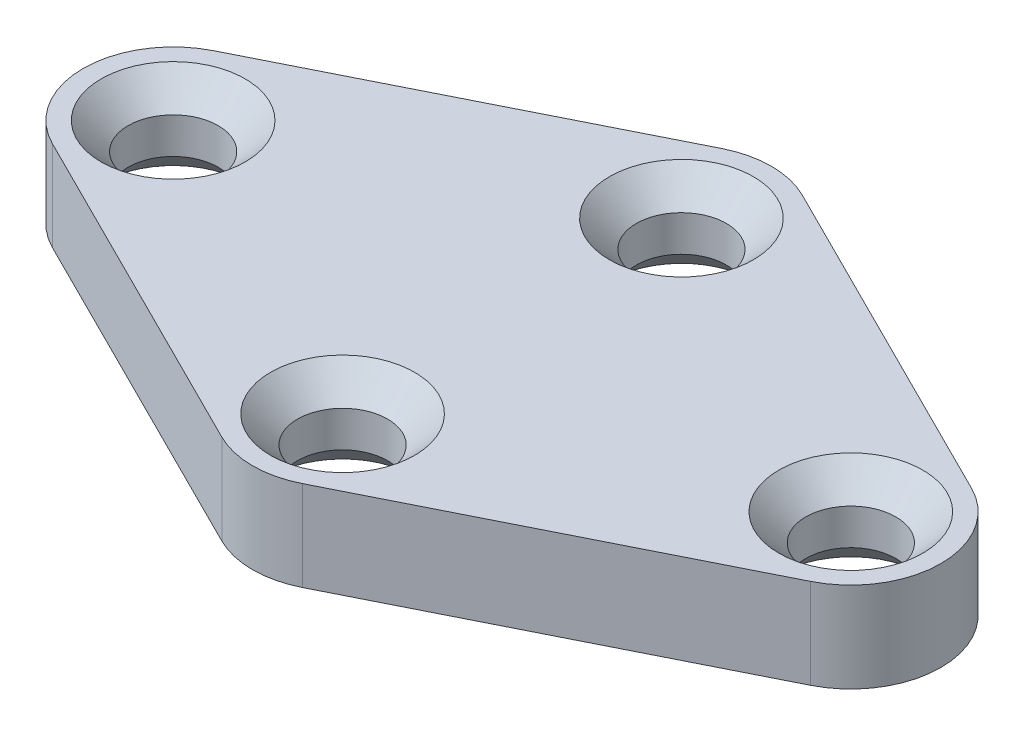
ISO-10303-21;
HEADER;
FILE_DESCRIPTION(('STEP AP214'),'2;1');
FILE_NAME('part.step','',(''),(''),'','','');
FILE_SCHEMA(('AUTOMOTIVE_DESIGN { 1 0 10303 214 1 1 1 1 }'));
ENDSEC;
DATA;
#1=APPLICATION_CONTEXT('core data for automotive mechanical design processes');
#2=APPLICATION_PROTOCOL_DEFINITION('international standard','automotive_design',2000,#1);
#3=PRODUCT_CONTEXT('',#1,'mechanical');
#4=PRODUCT('Part','Part','',(#3));
#5=PRODUCT_RELATED_PRODUCT_CATEGORY('part','',(#4));
#6=PRODUCT_DEFINITION_FORMATION('','',#4);
#7=PRODUCT_DEFINITION_CONTEXT('part definition',#1,'design');
#8=PRODUCT_DEFINITION('design','',#6,#7);
#9=PRODUCT_DEFINITION_SHAPE('','',#8);
#10=(LENGTH_UNIT() NAMED_UNIT(*) SI_UNIT(.MILLI.,.METRE.));
#11=(NAMED_UNIT(*) PLANE_ANGLE_UNIT() SI_UNIT($,.RADIAN.));
#12=(NAMED_UNIT(*) SI_UNIT($,.STERADIAN.) SOLID_ANGLE_UNIT());
#13=UNCERTAINTY_MEASURE_WITH_UNIT(LENGTH_MEASURE(1.E-05),#10,'distance_accuracy_value','');
#14=(GEOMETRIC_REPRESENTATION_CONTEXT(3) GLOBAL_UNCERTAINTY_ASSIGNED_CONTEXT((#13)) GLOBAL_UNIT_ASSIGNED_CONTEXT((#10,
#11,#12)) REPRESENTATION_CONTEXT('',''));
#15=CARTESIAN_POINT('',(0.,0.,0.));
#16=DIRECTION('',(0.,0.,1.));
#17=DIRECTION('',(1.,0.,0.));
#18=AXIS2_PLACEMENT_3D('',#15,#16,#17);
#19=CARTESIAN_POINT('',(0.,10.,18.8196601125011));
#20=DIRECTION('',(0.,1.,0.));
#21=DIRECTION('',(0.,0.,1.));
#22=AXIS2_PLACEMENT_3D('',#19,#20,#21);
#23=PLANE('',#22);
#24=CARTESIAN_POINT('',(0.,10.,18.8196601125011));
#25=DIRECTION('',(0.,1.,0.));
#26=DIRECTION('',(0.,0.,1.));
#27=AXIS2_PLACEMENT_3D('',#24,#25,#26);
#28=CIRCLE('',#27,7.99999999999999);
#29=CARTESIAN_POINT('',(0.,10.,26.8196601125011));
#30=VERTEX_POINT('',#29);
#31=EDGE_CURVE('E186',#30,#30,#28,.F.);
#32=ORIENTED_EDGE('',*,*,#31,.T.);
#33=EDGE_LOOP('',(#32));
#34=FACE_BOUND('',#33,.T.);
#35=CARTESIAN_POINT('',(37.6393202250021,10.,0.));
#36=DIRECTION('',(0.,1.,0.));
#37=DIRECTION('',(0.,0.,1.));
#38=AXIS2_PLACEMENT_3D('',#35,#36,#37);
#39=CIRCLE('',#38,7.99999999999999);
#40=CARTESIAN_POINT('',(37.6393202250021,10.,8.));
#41=VERTEX_POINT('',#40);
#42=EDGE_CURVE('E183',#41,#41,#39,.F.);
#43=ORIENTED_EDGE('',*,*,#42,.T.);
#44=EDGE_LOOP('',(#43));
#45=FACE_BOUND('',#44,.T.);
#46=CARTESIAN_POINT('',(0.,10.,-18.819660112501));
#47=DIRECTION('',(0.,1.,0.));
#48=DIRECTION('',(0.,0.,1.));
#49=AXIS2_PLACEMENT_3D('',#46,#47,#48);
#50=CIRCLE('',#49,8.00000000000001);
#51=CARTESIAN_POINT('',(0.,10.,-10.819660112501));
#52=VERTEX_POINT('',#51);
#53=EDGE_CURVE('E180',#52,#52,#50,.F.);
#54=ORIENTED_EDGE('',*,*,#53,.T.);
#55=EDGE_LOOP('',(#54));
#56=FACE_BOUND('',#55,.T.);
#57=CARTESIAN_POINT('',(-37.6393202250021,10.,0.));
#58=DIRECTION('',(0.,1.,0.));
#59=DIRECTION('',(0.,0.,1.));
#60=AXIS2_PLACEMENT_3D('',#57,#58,#59);
#61=CIRCLE('',#60,7.99999999999999);
#62=CARTESIAN_POINT('',(-37.6393202250021,10.,7.99999999999999));
#63=VERTEX_POINT('',#62);
#64=EDGE_CURVE('E177',#63,#63,#61,.F.);
#65=ORIENTED_EDGE('',*,*,#64,.T.);
#66=EDGE_LOOP('',(#65));
#67=FACE_BOUND('',#66,.T.);
#68=CARTESIAN_POINT('',(0.,10.,18.8196601125011));
#69=DIRECTION('',(0.,1.,0.));
#70=DIRECTION('',(0.,0.,1.));
#71=AXIS2_PLACEMENT_3D('',#68,#69,#70);
#72=CIRCLE('',#71,10.);
#73=CARTESIAN_POINT('',(-4.4721359549996,10.,27.7639320225002));
#74=VERTEX_POINT('',#73);
#75=CARTESIAN_POINT('',(4.47213595499964,10.,27.7639320225002));
#76=VERTEX_POINT('',#75);
#77=EDGE_CURVE('E144',#74,#76,#72,.T.);
#78=ORIENTED_EDGE('',*,*,#77,.T.);
#79=DIRECTION('',(0.894427190999916,0.,-0.447213595499958));
#80=VECTOR('',#79,1.);
#81=CARTESIAN_POINT('',(4.47213595499964,10.,27.7639320225002));
#82=LINE('',#81,#80);
#83=CARTESIAN_POINT('',(42.1114561800015,10.,8.94427190999924));
#84=VERTEX_POINT('',#83);
#85=EDGE_CURVE('E94',#76,#84,#82,.T.);
#86=ORIENTED_EDGE('',*,*,#85,.T.);
#87=CARTESIAN_POINT('',(37.6393202250021,10.,0.));
#88=DIRECTION('',(0.,1.,0.));
#89=DIRECTION('',(0.,0.,1.));
#90=AXIS2_PLACEMENT_3D('',#87,#88,#89);
#91=CIRCLE('',#90,10.);
#92=CARTESIAN_POINT('',(42.1114561800015,10.,-8.94427190999924));
#93=VERTEX_POINT('',#92);
#94=EDGE_CURVE('E302',#84,#93,#91,.T.);
#95=ORIENTED_EDGE('',*,*,#94,.T.);
#96=DIRECTION('',(-0.894427190999916,0.,-0.447213595499958));
#97=VECTOR('',#96,1.);
#98=CARTESIAN_POINT('',(42.1114561800015,10.,-8.94427190999924));
#99=LINE('',#98,#97);
#100=CARTESIAN_POINT('',(4.47213595499963,10.,-27.7639320225002));
#101=VERTEX_POINT('',#100);
#102=EDGE_CURVE('E306',#93,#101,#99,.T.);
#103=ORIENTED_EDGE('',*,*,#102,.T.);
#104=CARTESIAN_POINT('',(0.,10.,-18.819660112501));
#105=DIRECTION('',(0.,1.,0.));
#106=DIRECTION('',(0.,0.,-1.));
#107=AXIS2_PLACEMENT_3D('',#104,#105,#106);
#108=CIRCLE('',#107,10.);
#109=CARTESIAN_POINT('',(-4.47213595499961,10.,-27.7639320225002));
#110=VERTEX_POINT('',#109);
#111=EDGE_CURVE('E112',#101,#110,#108,.T.);
#112=ORIENTED_EDGE('',*,*,#111,.T.);
#113=DIRECTION('',(-0.894427190999916,0.,0.447213595499958));
#114=VECTOR('',#113,1.);
#115=CARTESIAN_POINT('',(-4.47213595499961,10.,-27.7639320225002));
#116=LINE('',#115,#114);
#117=CARTESIAN_POINT('',(-42.1114561800015,10.,-8.94427190999923));
#118=VERTEX_POINT('',#117);
#119=EDGE_CURVE('E107',#110,#118,#116,.T.);
#120=ORIENTED_EDGE('',*,*,#119,.T.);
#121=CARTESIAN_POINT('',(-37.6393202250021,10.,0.));
#122=DIRECTION('',(0.,1.,0.));
#123=DIRECTION('',(0.,0.,1.));
#124=AXIS2_PLACEMENT_3D('',#121,#122,#123);
#125=CIRCLE('',#124,9.99999999999999);
#126=CARTESIAN_POINT('',(-42.1114561800015,10.,8.94427190999924));
#127=VERTEX_POINT('',#126);
#128=EDGE_CURVE('E110',#118,#127,#125,.T.);
#129=ORIENTED_EDGE('',*,*,#128,.T.);
#130=DIRECTION('',(0.894427190999916,0.,0.447213595499958));
#131=VECTOR('',#130,1.);
#132=CARTESIAN_POINT('',(-42.1114561800015,10.,8.94427190999924));
#133=LINE('',#132,#131);
#134=EDGE_CURVE('E50',#127,#74,#133,.T.);
#135=ORIENTED_EDGE('',*,*,#134,.T.);
#136=EDGE_LOOP('',(#78,#86,#95,#103,#112,#120,#129,#135));
#137=FACE_BOUND('',#136,.T.);
#138=ADVANCED_FACE('F33',(#34,#45,#56,#67,#137),#23,.T.);
#139=CARTESIAN_POINT('',(0.,0.,18.8196601125011));
#140=DIRECTION('',(0.,1.,0.));
#141=DIRECTION('',(0.,0.,1.));
#142=AXIS2_PLACEMENT_3D('',#139,#140,#141);
#143=PLANE('',#142);
#144=CARTESIAN_POINT('',(0.,0.,18.8196601125011));
#145=DIRECTION('',(0.,1.,0.));
#146=DIRECTION('',(0.,0.,1.));
#147=AXIS2_PLACEMENT_3D('',#144,#145,#146);
#148=CIRCLE('',#147,8.00000000000002);
#149=CARTESIAN_POINT('',(0.,0.,26.8196601125011));
#150=VERTEX_POINT('',#149);
#151=EDGE_CURVE('E168',#150,#150,#148,.T.);
#152=ORIENTED_EDGE('',*,*,#151,.T.);
#153=EDGE_LOOP('',(#152));
#154=FACE_BOUND('',#153,.T.);
#155=CARTESIAN_POINT('',(37.6393202250021,0.,0.));
#156=DIRECTION('',(0.,1.,0.));
#157=DIRECTION('',(0.,0.,1.));
#158=AXIS2_PLACEMENT_3D('',#155,#156,#157);
#159=CIRCLE('',#158,8.00000000000001);
#160=CARTESIAN_POINT('',(37.6393202250021,0.,-8.));
#161=VERTEX_POINT('',#160);
#162=EDGE_CURVE('E165',#161,#161,#159,.T.);
#163=ORIENTED_EDGE('',*,*,#162,.T.);
#164=EDGE_LOOP('',(#163));
#165=FACE_BOUND('',#164,.T.);
#166=CARTESIAN_POINT('',(0.,0.,-18.819660112501));
#167=DIRECTION('',(0.,1.,0.));
#168=DIRECTION('',(0.,0.,1.));
#169=AXIS2_PLACEMENT_3D('',#166,#167,#168);
#170=CIRCLE('',#169,8.00000000000002);
#171=CARTESIAN_POINT('',(0.,0.,-10.819660112501));
#172=VERTEX_POINT('',#171);
#173=EDGE_CURVE('E162',#172,#172,#170,.T.);
#174=ORIENTED_EDGE('',*,*,#173,.T.);
#175=EDGE_LOOP('',(#174));
#176=FACE_BOUND('',#175,.T.);
#177=CARTESIAN_POINT('',(-37.6393202250021,0.,0.));
#178=DIRECTION('',(0.,1.,0.));
#179=DIRECTION('',(0.,0.,1.));
#180=AXIS2_PLACEMENT_3D('',#177,#178,#179);
#181=CIRCLE('',#180,8.00000000000001);
#182=CARTESIAN_POINT('',(-37.6393202250021,0.,-8.00000000000001));
#183=VERTEX_POINT('',#182);
#184=EDGE_CURVE('E159',#183,#183,#181,.T.);
#185=ORIENTED_EDGE('',*,*,#184,.T.);
#186=EDGE_LOOP('',(#185));
#187=FACE_BOUND('',#186,.T.);
#188=CARTESIAN_POINT('',(0.,0.,18.8196601125011));
#189=DIRECTION('',(0.,1.,0.));
#190=DIRECTION('',(0.,0.,1.));
#191=AXIS2_PLACEMENT_3D('',#188,#189,#190);
#192=CIRCLE('',#191,10.);
#193=CARTESIAN_POINT('',(-4.4721359549996,0.,27.7639320225002));
#194=VERTEX_POINT('',#193);
#195=CARTESIAN_POINT('',(4.47213595499964,0.,27.7639320225002));
#196=VERTEX_POINT('',#195);
#197=EDGE_CURVE('E130',#194,#196,#192,.T.);
#198=ORIENTED_EDGE('',*,*,#197,.F.);
#199=DIRECTION('',(0.894427190999916,0.,0.447213595499958));
#200=VECTOR('',#199,1.);
#201=CARTESIAN_POINT('',(-42.1114561800015,0.,8.94427190999924));
#202=LINE('',#201,#200);
#203=CARTESIAN_POINT('',(-42.1114561800015,0.,8.94427190999924));
#204=VERTEX_POINT('',#203);
#205=EDGE_CURVE('E85',#204,#194,#202,.T.);
#206=ORIENTED_EDGE('',*,*,#205,.F.);
#207=CARTESIAN_POINT('',(-37.6393202250021,0.,0.));
#208=DIRECTION('',(0.,1.,0.));
#209=DIRECTION('',(0.,0.,1.));
#210=AXIS2_PLACEMENT_3D('',#207,#208,#209);
#211=CIRCLE('',#210,9.99999999999999);
#212=CARTESIAN_POINT('',(-42.1114561800015,0.,-8.94427190999923));
#213=VERTEX_POINT('',#212);
#214=EDGE_CURVE('E79',#213,#204,#211,.T.);
#215=ORIENTED_EDGE('',*,*,#214,.F.);
#216=DIRECTION('',(-0.894427190999916,0.,0.447213595499958));
#217=VECTOR('',#216,1.);
#218=CARTESIAN_POINT('',(-4.47213595499961,0.,-27.7639320225002));
#219=LINE('',#218,#217);
#220=CARTESIAN_POINT('',(-4.47213595499961,0.,-27.7639320225002));
#221=VERTEX_POINT('',#220);
#222=EDGE_CURVE('E120',#221,#213,#219,.T.);
#223=ORIENTED_EDGE('',*,*,#222,.F.);
#224=CARTESIAN_POINT('',(0.,0.,-18.819660112501));
#225=DIRECTION('',(0.,1.,0.));
#226=DIRECTION('',(0.,0.,-1.));
#227=AXIS2_PLACEMENT_3D('',#224,#225,#226);
#228=CIRCLE('',#227,10.);
#229=CARTESIAN_POINT('',(4.47213595499963,0.,-27.7639320225002));
#230=VERTEX_POINT('',#229);
#231=EDGE_CURVE('E139',#230,#221,#228,.T.);
#232=ORIENTED_EDGE('',*,*,#231,.F.);
#233=DIRECTION('',(-0.894427190999916,0.,-0.447213595499958));
#234=VECTOR('',#233,1.);
#235=CARTESIAN_POINT('',(42.1114561800015,0.,-8.94427190999924));
#236=LINE('',#235,#234);
#237=CARTESIAN_POINT('',(42.1114561800015,0.,-8.94427190999924));
#238=VERTEX_POINT('',#237);
#239=EDGE_CURVE('E137',#238,#230,#236,.T.);
#240=ORIENTED_EDGE('',*,*,#239,.F.);
#241=CARTESIAN_POINT('',(37.6393202250021,0.,0.));
#242=DIRECTION('',(0.,1.,0.));
#243=DIRECTION('',(0.,0.,1.));
#244=AXIS2_PLACEMENT_3D('',#241,#242,#243);
#245=CIRCLE('',#244,10.);
#246=CARTESIAN_POINT('',(42.1114561800015,0.,8.94427190999924));
#247=VERTEX_POINT('',#246);
#248=EDGE_CURVE('E135',#247,#238,#245,.T.);
#249=ORIENTED_EDGE('',*,*,#248,.F.);
#250=DIRECTION('',(0.894427190999916,0.,-0.447213595499958));
#251=VECTOR('',#250,1.);
#252=CARTESIAN_POINT('',(4.47213595499964,0.,27.7639320225002));
#253=LINE('',#252,#251);
#254=EDGE_CURVE('E133',#196,#247,#253,.T.);
#255=ORIENTED_EDGE('',*,*,#254,.F.);
#256=EDGE_LOOP('',(#198,#206,#215,#223,#232,#240,#249,#255));
#257=FACE_BOUND('',#256,.T.);
#258=ADVANCED_FACE('F215',(#154,#165,#176,#187,#257),#143,.F.);
#259=CARTESIAN_POINT('',(0.,10.,18.8196601125011));
#260=DIRECTION('',(0.,-1.,0.));
#261=DIRECTION('',(0.,0.,-1.));
#262=AXIS2_PLACEMENT_3D('',#259,#260,#261);
#263=CYLINDRICAL_SURFACE('',#262,10.);
#264=ORIENTED_EDGE('',*,*,#197,.T.);
#265=DIRECTION('',(0.,-1.,0.));
#266=VECTOR('',#265,1.);
#267=CARTESIAN_POINT('',(4.47213595499964,10.,27.7639320225002));
#268=LINE('',#267,#266);
#269=EDGE_CURVE('E157',#76,#196,#268,.T.);
#270=ORIENTED_EDGE('',*,*,#269,.F.);
#271=ORIENTED_EDGE('',*,*,#77,.F.);
#272=DIRECTION('',(0.,-1.,0.));
#273=VECTOR('',#272,1.);
#274=CARTESIAN_POINT('',(-4.4721359549996,10.,27.7639320225002));
#275=LINE('',#274,#273);
#276=EDGE_CURVE('E126',#74,#194,#275,.T.);
#277=ORIENTED_EDGE('',*,*,#276,.T.);
#278=EDGE_LOOP('',(#264,#270,#271,#277));
#279=FACE_BOUND('',#278,.T.);
#280=ADVANCED_FACE('F221',(#279),#263,.T.);
#281=CARTESIAN_POINT('',(4.47213595499964,10.,27.7639320225002));
#282=DIRECTION('',(-0.447213595499958,0.,-0.894427190999916));
#283=DIRECTION('',(-0.894427190999916,0.,0.447213595499958));
#284=AXIS2_PLACEMENT_3D('',#281,#282,#283);
#285=PLANE('',#284);
#286=ORIENTED_EDGE('',*,*,#254,.T.);
#287=DIRECTION('',(0.,-1.,0.));
#288=VECTOR('',#287,1.);
#289=CARTESIAN_POINT('',(42.1114561800015,10.,8.94427190999924));
#290=LINE('',#289,#288);
#291=EDGE_CURVE('E154',#84,#247,#290,.T.);
#292=ORIENTED_EDGE('',*,*,#291,.F.);
#293=ORIENTED_EDGE('',*,*,#85,.F.);
#294=ORIENTED_EDGE('',*,*,#269,.T.);
#295=EDGE_LOOP('',(#286,#292,#293,#294));
#296=FACE_BOUND('',#295,.T.);
#297=ADVANCED_FACE('F247',(#296),#285,.F.);
#298=CARTESIAN_POINT('',(37.6393202250021,10.,0.));
#299=DIRECTION('',(0.,-1.,0.));
#300=DIRECTION('',(0.,0.,-1.));
#301=AXIS2_PLACEMENT_3D('',#298,#299,#300);
#302=CYLINDRICAL_SURFACE('',#301,10.);
#303=ORIENTED_EDGE('',*,*,#248,.T.);
#304=DIRECTION('',(0.,-1.,0.));
#305=VECTOR('',#304,1.);
#306=CARTESIAN_POINT('',(42.1114561800015,10.,-8.94427190999924));
#307=LINE('',#306,#305);
#308=EDGE_CURVE('E151',#93,#238,#307,.T.);
#309=ORIENTED_EDGE('',*,*,#308,.F.);
#310=ORIENTED_EDGE('',*,*,#94,.F.);
#311=ORIENTED_EDGE('',*,*,#291,.T.);
#312=EDGE_LOOP('',(#303,#309,#310,#311));
#313=FACE_BOUND('',#312,.T.);
#314=ADVANCED_FACE('F243',(#313),#302,.T.);
#315=CARTESIAN_POINT('',(42.1114561800015,10.,-8.94427190999924));
#316=DIRECTION('',(-0.447213595499958,0.,0.894427190999916));
#317=DIRECTION('',(0.894427190999916,0.,0.447213595499958));
#318=AXIS2_PLACEMENT_3D('',#315,#316,#317);
#319=PLANE('',#318);
#320=ORIENTED_EDGE('',*,*,#239,.T.);
#321=DIRECTION('',(0.,-1.,0.));
#322=VECTOR('',#321,1.);
#323=CARTESIAN_POINT('',(4.47213595499963,10.,-27.7639320225002));
#324=LINE('',#323,#322);
#325=EDGE_CURVE('E148',#101,#230,#324,.T.);
#326=ORIENTED_EDGE('',*,*,#325,.F.);
#327=ORIENTED_EDGE('',*,*,#102,.F.);
#328=ORIENTED_EDGE('',*,*,#308,.T.);
#329=EDGE_LOOP('',(#320,#326,#327,#328));
#330=FACE_BOUND('',#329,.T.);
#331=ADVANCED_FACE('F239',(#330),#319,.F.);
#332=CARTESIAN_POINT('',(0.,10.,-18.819660112501));
#333=DIRECTION('',(0.,-1.,0.));
#334=DIRECTION('',(0.,0.,-1.));
#335=AXIS2_PLACEMENT_3D('',#332,#333,#334);
#336=CYLINDRICAL_SURFACE('',#335,10.);
#337=ORIENTED_EDGE('',*,*,#231,.T.);
#338=DIRECTION('',(0.,-1.,0.));
#339=VECTOR('',#338,1.);
#340=CARTESIAN_POINT('',(-4.47213595499961,10.,-27.7639320225002));
#341=LINE('',#340,#339);
#342=EDGE_CURVE('E121',#110,#221,#341,.T.);
#343=ORIENTED_EDGE('',*,*,#342,.F.);
#344=ORIENTED_EDGE('',*,*,#111,.F.);
#345=ORIENTED_EDGE('',*,*,#325,.T.);
#346=EDGE_LOOP('',(#337,#343,#344,#345));
#347=FACE_BOUND('',#346,.T.);
#348=ADVANCED_FACE('F236',(#347),#336,.T.);
#349=CARTESIAN_POINT('',(-4.47213595499961,10.,-27.7639320225002));
#350=DIRECTION('',(0.447213595499958,0.,0.894427190999916));
#351=DIRECTION('',(0.894427190999916,0.,-0.447213595499958));
#352=AXIS2_PLACEMENT_3D('',#349,#350,#351);
#353=PLANE('',#352);
#354=ORIENTED_EDGE('',*,*,#222,.T.);
#355=DIRECTION('',(0.,-1.,0.));
#356=VECTOR('',#355,1.);
#357=CARTESIAN_POINT('',(-42.1114561800015,10.,-8.94427190999923));
#358=LINE('',#357,#356);
#359=EDGE_CURVE('E117',#118,#213,#358,.T.);
#360=ORIENTED_EDGE('',*,*,#359,.F.);
#361=ORIENTED_EDGE('',*,*,#119,.F.);
#362=ORIENTED_EDGE('',*,*,#342,.T.);
#363=EDGE_LOOP('',(#354,#360,#361,#362));
#364=FACE_BOUND('',#363,.T.);
#365=ADVANCED_FACE('F118',(#364),#353,.F.);
#366=CARTESIAN_POINT('',(-37.6393202250021,10.,0.));
#367=DIRECTION('',(0.,-1.,0.));
#368=DIRECTION('',(0.,0.,-1.));
#369=AXIS2_PLACEMENT_3D('',#366,#367,#368);
#370=CYLINDRICAL_SURFACE('',#369,9.99999999999999);
#371=ORIENTED_EDGE('',*,*,#214,.T.);
#372=DIRECTION('',(0.,-1.,0.));
#373=VECTOR('',#372,1.);
#374=CARTESIAN_POINT('',(-42.1114561800015,10.,8.94427190999924));
#375=LINE('',#374,#373);
#376=EDGE_CURVE('E122',#127,#204,#375,.T.);
#377=ORIENTED_EDGE('',*,*,#376,.F.);
#378=ORIENTED_EDGE('',*,*,#128,.F.);
#379=ORIENTED_EDGE('',*,*,#359,.T.);
#380=EDGE_LOOP('',(#371,#377,#378,#379));
#381=FACE_BOUND('',#380,.T.);
#382=ADVANCED_FACE('F124',(#381),#370,.T.);
#383=CARTESIAN_POINT('',(-42.1114561800015,10.,8.94427190999924));
#384=DIRECTION('',(0.447213595499958,0.,-0.894427190999916));
#385=DIRECTION('',(-0.894427190999916,0.,-0.447213595499958));
#386=AXIS2_PLACEMENT_3D('',#383,#384,#385);
#387=PLANE('',#386);
#388=ORIENTED_EDGE('',*,*,#205,.T.);
#389=ORIENTED_EDGE('',*,*,#276,.F.);
#390=ORIENTED_EDGE('',*,*,#134,.F.);
#391=ORIENTED_EDGE('',*,*,#376,.T.);
#392=EDGE_LOOP('',(#388,#389,#390,#391));
#393=FACE_BOUND('',#392,.T.);
#394=ADVANCED_FACE('F229',(#393),#387,.F.);
#395=CARTESIAN_POINT('',(0.,10.,-18.819660112501));
#396=DIRECTION('',(0.,-1.,0.));
#397=DIRECTION('',(0.,0.,-1.));
#398=AXIS2_PLACEMENT_3D('',#395,#396,#397);
#399=CYLINDRICAL_SURFACE('',#398,5.);
#400=CARTESIAN_POINT('',(0.,3.00000000000003,-18.819660112501));
#401=DIRECTION('',(0.,1.,0.));
#402=DIRECTION('',(0.,0.,1.));
#403=AXIS2_PLACEMENT_3D('',#400,#401,#402);
#404=CIRCLE('',#403,5.);
#405=CARTESIAN_POINT('',(0.,3.00000000000003,-13.819660112501));
#406=VERTEX_POINT('',#405);
#407=EDGE_CURVE('E198',#406,#406,#404,.F.);
#408=ORIENTED_EDGE('',*,*,#407,.T.);
#409=EDGE_LOOP('',(#408));
#410=FACE_BOUND('',#409,.T.);
#411=CARTESIAN_POINT('',(0.,6.99999999999999,-18.819660112501));
#412=DIRECTION('',(0.,1.,0.));
#413=DIRECTION('',(0.,0.,1.));
#414=AXIS2_PLACEMENT_3D('',#411,#412,#413);
#415=CIRCLE('',#414,5.);
#416=CARTESIAN_POINT('',(0.,6.99999999999999,-13.819660112501));
#417=VERTEX_POINT('',#416);
#418=EDGE_CURVE('E195',#417,#417,#415,.T.);
#419=ORIENTED_EDGE('',*,*,#418,.T.);
#420=EDGE_LOOP('',(#419));
#421=FACE_BOUND('',#420,.T.);
#422=ADVANCED_FACE('F226',(#410,#421),#399,.F.);
#423=CARTESIAN_POINT('',(37.6393202250021,10.,0.));
#424=DIRECTION('',(0.,-1.,0.));
#425=DIRECTION('',(0.,0.,-1.));
#426=AXIS2_PLACEMENT_3D('',#423,#424,#425);
#427=CYLINDRICAL_SURFACE('',#426,5.);
#428=CARTESIAN_POINT('',(37.6393202250021,3.00000000000001,0.));
#429=DIRECTION('',(0.,1.,0.));
#430=DIRECTION('',(0.,0.,1.));
#431=AXIS2_PLACEMENT_3D('',#428,#429,#430);
#432=CIRCLE('',#431,5.);
#433=CARTESIAN_POINT('',(37.6393202250021,3.00000000000001,-4.99999999999999));
#434=VERTEX_POINT('',#433);
#435=EDGE_CURVE('E192',#434,#434,#432,.F.);
#436=ORIENTED_EDGE('',*,*,#435,.T.);
#437=EDGE_LOOP('',(#436));
#438=FACE_BOUND('',#437,.T.);
#439=CARTESIAN_POINT('',(37.6393202250021,7.00000000000002,0.));
#440=DIRECTION('',(0.,1.,0.));
#441=DIRECTION('',(0.,0.,1.));
#442=AXIS2_PLACEMENT_3D('',#439,#440,#441);
#443=CIRCLE('',#442,5.);
#444=CARTESIAN_POINT('',(37.6393202250021,7.00000000000002,5.));
#445=VERTEX_POINT('',#444);
#446=EDGE_CURVE('E189',#445,#445,#443,.T.);
#447=ORIENTED_EDGE('',*,*,#446,.T.);
#448=EDGE_LOOP('',(#447));
#449=FACE_BOUND('',#448,.T.);
#450=ADVANCED_FACE('F283',(#438,#449),#427,.F.);
#451=CARTESIAN_POINT('',(0.,10.,18.8196601125011));
#452=DIRECTION('',(0.,-1.,0.));
#453=DIRECTION('',(0.,0.,-1.));
#454=AXIS2_PLACEMENT_3D('',#451,#452,#453);
#455=CYLINDRICAL_SURFACE('',#454,5.);
#456=CARTESIAN_POINT('',(0.,3.00000000000003,18.8196601125011));
#457=DIRECTION('',(0.,1.,0.));
#458=DIRECTION('',(0.,0.,1.));
#459=AXIS2_PLACEMENT_3D('',#456,#457,#458);
#460=CIRCLE('',#459,5.);
#461=CARTESIAN_POINT('',(0.,3.00000000000003,23.8196601125011));
#462=VERTEX_POINT('',#461);
#463=EDGE_CURVE('E174',#462,#462,#460,.F.);
#464=ORIENTED_EDGE('',*,*,#463,.T.);
#465=EDGE_LOOP('',(#464));
#466=FACE_BOUND('',#465,.T.);
#467=CARTESIAN_POINT('',(0.,7.00000000000002,18.8196601125011));
#468=DIRECTION('',(0.,1.,0.));
#469=DIRECTION('',(0.,0.,1.));
#470=AXIS2_PLACEMENT_3D('',#467,#468,#469);
#471=CIRCLE('',#470,5.);
#472=CARTESIAN_POINT('',(0.,7.00000000000002,23.8196601125011));
#473=VERTEX_POINT('',#472);
#474=EDGE_CURVE('E171',#473,#473,#471,.T.);
#475=ORIENTED_EDGE('',*,*,#474,.T.);
#476=EDGE_LOOP('',(#475));
#477=FACE_BOUND('',#476,.T.);
#478=ADVANCED_FACE('F288',(#466,#477),#455,.F.);
#479=CARTESIAN_POINT('',(-37.6393202250021,10.,0.));
#480=DIRECTION('',(0.,-1.,0.));
#481=DIRECTION('',(0.,0.,-1.));
#482=AXIS2_PLACEMENT_3D('',#479,#480,#481);
#483=CYLINDRICAL_SURFACE('',#482,5.);
#484=CARTESIAN_POINT('',(-37.6393202250021,3.00000000000001,0.));
#485=DIRECTION('',(0.,1.,0.));
#486=DIRECTION('',(0.,0.,1.));
#487=AXIS2_PLACEMENT_3D('',#484,#485,#486);
#488=CIRCLE('',#487,5.);
#489=CARTESIAN_POINT('',(-37.6393202250021,3.00000000000001,-5.));
#490=VERTEX_POINT('',#489);
#491=EDGE_CURVE('E11',#490,#490,#488,.F.);
#492=ORIENTED_EDGE('',*,*,#491,.T.);
#493=EDGE_LOOP('',(#492));
#494=FACE_BOUND('',#493,.T.);
#495=CARTESIAN_POINT('',(-37.6393202250021,7.00000000000002,0.));
#496=DIRECTION('',(0.,1.,0.));
#497=DIRECTION('',(0.,0.,1.));
#498=AXIS2_PLACEMENT_3D('',#495,#496,#497);
#499=CIRCLE('',#498,5.);
#500=CARTESIAN_POINT('',(-37.6393202250021,7.00000000000002,5.));
#501=VERTEX_POINT('',#500);
#502=EDGE_CURVE('E42',#501,#501,#499,.T.);
#503=ORIENTED_EDGE('',*,*,#502,.T.);
#504=EDGE_LOOP('',(#503));
#505=FACE_BOUND('',#504,.T.);
#506=ADVANCED_FACE('F203',(#494,#505),#483,.F.);
#507=CARTESIAN_POINT('',(0.,0.,18.8196601125011));
#508=DIRECTION('',(0.,-1.,0.));
#509=DIRECTION('',(0.,0.,-1.));
#510=AXIS2_PLACEMENT_3D('',#507,#508,#509);
#511=CONICAL_SURFACE('',#510,8.00000000000002,0.785398163397447);
#512=ORIENTED_EDGE('',*,*,#463,.F.);
#513=EDGE_LOOP('',(#512));
#514=FACE_BOUND('',#513,.T.);
#515=ORIENTED_EDGE('',*,*,#151,.F.);
#516=EDGE_LOOP('',(#515));
#517=FACE_BOUND('',#516,.T.);
#518=ADVANCED_FACE('F254',(#514,#517),#511,.F.);
#519=CARTESIAN_POINT('',(0.,7.00000000000002,18.8196601125011));
#520=DIRECTION('',(0.,1.,0.));
#521=DIRECTION('',(0.,0.,1.));
#522=AXIS2_PLACEMENT_3D('',#519,#520,#521);
#523=CONICAL_SURFACE('',#522,5.,0.78539816339745);
#524=ORIENTED_EDGE('',*,*,#31,.F.);
#525=EDGE_LOOP('',(#524));
#526=FACE_BOUND('',#525,.T.);
#527=ORIENTED_EDGE('',*,*,#474,.F.);
#528=EDGE_LOOP('',(#527));
#529=FACE_BOUND('',#528,.T.);
#530=ADVANCED_FACE('F257',(#526,#529),#523,.F.);
#531=CARTESIAN_POINT('',(37.6393202250021,0.,0.));
#532=DIRECTION('',(0.,-1.,0.));
#533=DIRECTION('',(0.,0.,-1.));
#534=AXIS2_PLACEMENT_3D('',#531,#532,#533);
#535=CONICAL_SURFACE('',#534,8.00000000000001,0.785398163397449);
#536=CARTESIAN_POINT('',(37.6393202250021,3.00000000000001,-4.99999999999999));
#537=CARTESIAN_POINT('',(37.6393202250021,2.96875000000001,-5.03124999999999));
#538=CARTESIAN_POINT('',(37.6393202250021,2.93750000000001,-5.06249999999999));
#539=CARTESIAN_POINT('',(37.6393202250021,2.87500000000001,-5.12499999999999));
#540=CARTESIAN_POINT('',(37.6393202250021,2.84375000000001,-5.15624999999999));
#541=CARTESIAN_POINT('',(37.6393202250021,2.78125000000001,-5.21874999999999));
#542=CARTESIAN_POINT('',(37.6393202250021,2.75,-5.25));
#543=CARTESIAN_POINT('',(37.6393202250021,2.6875,-5.3125));
#544=CARTESIAN_POINT('',(37.6393202250021,2.65625,-5.34375));
#545=CARTESIAN_POINT('',(37.6393202250021,2.59375,-5.40625));
#546=CARTESIAN_POINT('',(37.6393202250021,2.5625,-5.4375));
#547=CARTESIAN_POINT('',(37.6393202250021,2.5,-5.5));
#548=CARTESIAN_POINT('',(37.6393202250021,2.46875,-5.53125));
#549=CARTESIAN_POINT('',(37.6393202250021,2.40625,-5.59375));
#550=CARTESIAN_POINT('',(37.6393202250021,2.375,-5.625));
#551=CARTESIAN_POINT('',(37.6393202250021,2.3125,-5.6875));
#552=CARTESIAN_POINT('',(37.6393202250021,2.28125,-5.71875));
#553=CARTESIAN_POINT('',(37.6393202250021,2.21875,-5.78125));
#554=CARTESIAN_POINT('',(37.6393202250021,2.1875,-5.8125));
#555=CARTESIAN_POINT('',(37.6393202250021,2.125,-5.875));
#556=CARTESIAN_POINT('',(37.6393202250021,2.09375,-5.90625));
#557=CARTESIAN_POINT('',(37.6393202250021,2.03125,-5.96875));
#558=CARTESIAN_POINT('',(37.6393202250021,2.,-6.));
#559=CARTESIAN_POINT('',(37.6393202250021,1.9375,-6.0625));
#560=CARTESIAN_POINT('',(37.6393202250021,1.90625,-6.09375));
#561=CARTESIAN_POINT('',(37.6393202250021,1.84375,-6.15625));
#562=CARTESIAN_POINT('',(37.6393202250021,1.8125,-6.1875));
#563=CARTESIAN_POINT('',(37.6393202250021,1.75,-6.25));
#564=CARTESIAN_POINT('',(37.6393202250021,1.71875,-6.28125));
#565=CARTESIAN_POINT('',(37.6393202250021,1.65625,-6.34375));
#566=CARTESIAN_POINT('',(37.6393202250021,1.625,-6.375));
#567=CARTESIAN_POINT('',(37.6393202250021,1.5625,-6.4375));
#568=CARTESIAN_POINT('',(37.6393202250021,1.53125,-6.46875));
#569=CARTESIAN_POINT('',(37.6393202250021,1.46875,-6.53125));
#570=CARTESIAN_POINT('',(37.6393202250021,1.4375,-6.5625));
#571=CARTESIAN_POINT('',(37.6393202250021,1.375,-6.625));
#572=CARTESIAN_POINT('',(37.6393202250021,1.34375,-6.65625));
#573=CARTESIAN_POINT('',(37.6393202250021,1.28125,-6.71875));
#574=CARTESIAN_POINT('',(37.6393202250021,1.25,-6.75));
#575=CARTESIAN_POINT('',(37.6393202250021,1.1875,-6.8125));
#576=CARTESIAN_POINT('',(37.6393202250021,1.15625,-6.84375));
#577=CARTESIAN_POINT('',(37.6393202250021,1.09375,-6.90625));
#578=CARTESIAN_POINT('',(37.6393202250021,1.0625,-6.9375));
#579=CARTESIAN_POINT('',(37.6393202250021,1.,-7.));
#580=CARTESIAN_POINT('',(37.6393202250021,0.968750000000002,-7.03125));
#581=CARTESIAN_POINT('',(37.6393202250021,0.906250000000002,-7.09375));
#582=CARTESIAN_POINT('',(37.6393202250021,0.875000000000002,-7.125));
#583=CARTESIAN_POINT('',(37.6393202250021,0.812500000000001,-7.1875));
#584=CARTESIAN_POINT('',(37.6393202250021,0.781250000000001,-7.21875));
#585=CARTESIAN_POINT('',(37.6393202250021,0.718750000000001,-7.28125));
#586=CARTESIAN_POINT('',(37.6393202250021,0.687500000000001,-7.3125));
#587=CARTESIAN_POINT('',(37.6393202250021,0.625000000000001,-7.375));
#588=CARTESIAN_POINT('',(37.6393202250021,0.593750000000001,-7.40625));
#589=CARTESIAN_POINT('',(37.6393202250021,0.531250000000001,-7.46875));
#590=CARTESIAN_POINT('',(37.6393202250021,0.500000000000001,-7.5));
#591=CARTESIAN_POINT('',(37.6393202250021,0.437500000000001,-7.5625));
#592=CARTESIAN_POINT('',(37.6393202250021,0.406250000000001,-7.59375));
#593=CARTESIAN_POINT('',(37.6393202250021,0.343750000000001,-7.65625));
#594=CARTESIAN_POINT('',(37.6393202250021,0.312500000000001,-7.6875));
#595=CARTESIAN_POINT('',(37.6393202250021,0.25,-7.75));
#596=CARTESIAN_POINT('',(37.6393202250021,0.21875,-7.78125));
#597=CARTESIAN_POINT('',(37.6393202250021,0.15625,-7.84375));
#598=CARTESIAN_POINT('',(37.6393202250021,0.125,-7.875));
#599=CARTESIAN_POINT('',(37.6393202250021,0.0625,-7.9375));
#600=CARTESIAN_POINT('',(37.6393202250021,0.03125,-7.96875));
#601=CARTESIAN_POINT('',(37.6393202250021,0.,-8.));
#602=B_SPLINE_CURVE_WITH_KNOTS('',3,(#536,#537,#538,#539,#540,#541,#542,#543,#544,#545,#546,
#547,#548,#549,#550,#551,#552,#553,#554,#555,#556,#557,#558,#559,#560,#561,#562,#563,#564,#565,
#566,#567,#568,#569,#570,#571,#572,#573,#574,#575,#576,#577,#578,#579,#580,#581,#582,#583,#584,
#585,#586,#587,#588,#589,#590,#591,#592,#593,#594,#595,#596,#597,#598,#599,#600,#601),
.UNSPECIFIED.,.F.,.F.,(4,2,2,2,2,2,2,2,2,2,2,2,2,2,2,2,2,2,2,2,2,2,2,2,2,2,2,2,2,2,2,2,4),(0.,
0.132582521472478,0.265165042944956,0.397747564417434,0.530330085889912,0.66291260736239,
0.795495128834869,0.928077650307346,1.06066017177982,1.1932426932523,1.32582521472478,
1.45840773619726,1.59099025766974,1.72357277914221,1.85615530061469,1.98873782208717,
2.12132034355965,2.25390286503213,2.3864853865046,2.51906790797708,2.65165042944956,
2.78423295092204,2.91681547239452,3.04939799386699,3.18198051533947,3.31456303681195,
3.44714555828443,3.5797280797569,3.71231060122938,3.84489312270186,3.97747564417434,
4.11005816564682,4.2426406871193),.UNSPECIFIED.);
#603=EDGE_CURVE('BSEAM261',#434,#161,#602,.T.);
#604=ORIENTED_EDGE('',*,*,#435,.F.);
#605=ORIENTED_EDGE('',*,*,#162,.F.);
#606=ORIENTED_EDGE('',*,*,#603,.T.);
#607=ORIENTED_EDGE('',*,*,#603,.F.);
#608=EDGE_LOOP('',(#604,#606,#605,#607));
#609=FACE_BOUND('',#608,.T.);
#610=ADVANCED_FACE('F261',(#609),#535,.F.);
#611=CARTESIAN_POINT('',(37.6393202250021,7.00000000000002,0.));
#612=DIRECTION('',(0.,1.,0.));
#613=DIRECTION('',(0.,0.,1.));
#614=AXIS2_PLACEMENT_3D('',#611,#612,#613);
#615=CONICAL_SURFACE('',#614,5.,0.78539816339745);
#616=ORIENTED_EDGE('',*,*,#42,.F.);
#617=EDGE_LOOP('',(#616));
#618=FACE_BOUND('',#617,.T.);
#619=ORIENTED_EDGE('',*,*,#446,.F.);
#620=EDGE_LOOP('',(#619));
#621=FACE_BOUND('',#620,.T.);
#622=ADVANCED_FACE('F265',(#618,#621),#615,.F.);
#623=CARTESIAN_POINT('',(0.,0.,-18.819660112501));
#624=DIRECTION('',(0.,-1.,0.));
#625=DIRECTION('',(0.,0.,-1.));
#626=AXIS2_PLACEMENT_3D('',#623,#624,#625);
#627=CONICAL_SURFACE('',#626,8.00000000000002,0.785398163397447);
#628=ORIENTED_EDGE('',*,*,#407,.F.);
#629=EDGE_LOOP('',(#628));
#630=FACE_BOUND('',#629,.T.);
#631=ORIENTED_EDGE('',*,*,#173,.F.);
#632=EDGE_LOOP('',(#631));
#633=FACE_BOUND('',#632,.T.);
#634=ADVANCED_FACE('F269',(#630,#633),#627,.F.);
#635=CARTESIAN_POINT('',(0.,6.99999999999999,-18.819660112501));
#636=DIRECTION('',(0.,1.,0.));
#637=DIRECTION('',(0.,0.,1.));
#638=AXIS2_PLACEMENT_3D('',#635,#636,#637);
#639=CONICAL_SURFACE('',#638,5.,0.785398163397448);
#640=ORIENTED_EDGE('',*,*,#53,.F.);
#641=EDGE_LOOP('',(#640));
#642=FACE_BOUND('',#641,.T.);
#643=ORIENTED_EDGE('',*,*,#418,.F.);
#644=EDGE_LOOP('',(#643));
#645=FACE_BOUND('',#644,.T.);
#646=ADVANCED_FACE('F211',(#642,#645),#639,.F.);
#647=CARTESIAN_POINT('',(-37.6393202250021,0.,0.));
#648=DIRECTION('',(0.,-1.,0.));
#649=DIRECTION('',(0.,0.,-1.));
#650=AXIS2_PLACEMENT_3D('',#647,#648,#649);
#651=CONICAL_SURFACE('',#650,8.00000000000001,0.785398163397449);
#652=CARTESIAN_POINT('',(-37.6393202250021,3.00000000000001,-5.));
#653=CARTESIAN_POINT('',(-37.6393202250021,2.96875000000001,-5.03125));
#654=CARTESIAN_POINT('',(-37.6393202250021,2.93750000000001,-5.0625));
#655=CARTESIAN_POINT('',(-37.6393202250021,2.87500000000001,-5.125));
#656=CARTESIAN_POINT('',(-37.6393202250021,2.84375000000001,-5.15625));
#657=CARTESIAN_POINT('',(-37.6393202250021,2.78125000000001,-5.21875));
#658=CARTESIAN_POINT('',(-37.6393202250021,2.75,-5.25));
#659=CARTESIAN_POINT('',(-37.6393202250021,2.6875,-5.3125));
#660=CARTESIAN_POINT('',(-37.6393202250021,2.65625,-5.34375));
#661=CARTESIAN_POINT('',(-37.6393202250021,2.59375,-5.40625));
#662=CARTESIAN_POINT('',(-37.6393202250021,2.5625,-5.4375));
#663=CARTESIAN_POINT('',(-37.6393202250021,2.5,-5.5));
#664=CARTESIAN_POINT('',(-37.6393202250021,2.46875,-5.53125));
#665=CARTESIAN_POINT('',(-37.6393202250021,2.40625,-5.59375));
#666=CARTESIAN_POINT('',(-37.6393202250021,2.375,-5.625));
#667=CARTESIAN_POINT('',(-37.6393202250021,2.3125,-5.6875));
#668=CARTESIAN_POINT('',(-37.6393202250021,2.28125,-5.71875));
#669=CARTESIAN_POINT('',(-37.6393202250021,2.21875,-5.78125));
#670=CARTESIAN_POINT('',(-37.6393202250021,2.1875,-5.8125));
#671=CARTESIAN_POINT('',(-37.6393202250021,2.125,-5.875));
#672=CARTESIAN_POINT('',(-37.6393202250021,2.09375,-5.90625));
#673=CARTESIAN_POINT('',(-37.6393202250021,2.03125,-5.96875));
#674=CARTESIAN_POINT('',(-37.6393202250021,2.,-6.));
#675=CARTESIAN_POINT('',(-37.6393202250021,1.9375,-6.0625));
#676=CARTESIAN_POINT('',(-37.6393202250021,1.90625,-6.09375));
#677=CARTESIAN_POINT('',(-37.6393202250021,1.84375,-6.15625));
#678=CARTESIAN_POINT('',(-37.6393202250021,1.8125,-6.1875));
#679=CARTESIAN_POINT('',(-37.6393202250021,1.75,-6.25));
#680=CARTESIAN_POINT('',(-37.6393202250021,1.71875,-6.28125));
#681=CARTESIAN_POINT('',(-37.6393202250021,1.65625,-6.34375));
#682=CARTESIAN_POINT('',(-37.6393202250021,1.625,-6.375));
#683=CARTESIAN_POINT('',(-37.6393202250021,1.5625,-6.4375));
#684=CARTESIAN_POINT('',(-37.6393202250021,1.53125,-6.46875));
#685=CARTESIAN_POINT('',(-37.6393202250021,1.46875,-6.53125));
#686=CARTESIAN_POINT('',(-37.6393202250021,1.4375,-6.5625));
#687=CARTESIAN_POINT('',(-37.6393202250021,1.375,-6.625));
#688=CARTESIAN_POINT('',(-37.6393202250021,1.34375,-6.65625));
#689=CARTESIAN_POINT('',(-37.6393202250021,1.28125,-6.71875));
#690=CARTESIAN_POINT('',(-37.6393202250021,1.25,-6.75));
#691=CARTESIAN_POINT('',(-37.6393202250021,1.1875,-6.8125));
#692=CARTESIAN_POINT('',(-37.6393202250021,1.15625,-6.84375));
#693=CARTESIAN_POINT('',(-37.6393202250021,1.09375,-6.90625));
#694=CARTESIAN_POINT('',(-37.6393202250021,1.0625,-6.9375));
#695=CARTESIAN_POINT('',(-37.6393202250021,1.,-7.));
#696=CARTESIAN_POINT('',(-37.6393202250021,0.968750000000002,-7.03125));
#697=CARTESIAN_POINT('',(-37.6393202250021,0.906250000000002,-7.09375));
#698=CARTESIAN_POINT('',(-37.6393202250021,0.875000000000002,-7.125));
#699=CARTESIAN_POINT('',(-37.6393202250021,0.812500000000001,-7.1875));
#700=CARTESIAN_POINT('',(-37.6393202250021,0.781250000000001,-7.21875));
#701=CARTESIAN_POINT('',(-37.6393202250021,0.718750000000001,-7.28125));
#702=CARTESIAN_POINT('',(-37.6393202250021,0.687500000000001,-7.3125));
#703=CARTESIAN_POINT('',(-37.6393202250021,0.625000000000001,-7.375));
#704=CARTESIAN_POINT('',(-37.6393202250021,0.593750000000001,-7.40625));
#705=CARTESIAN_POINT('',(-37.6393202250021,0.531250000000001,-7.46875));
#706=CARTESIAN_POINT('',(-37.6393202250021,0.500000000000001,-7.5));
#707=CARTESIAN_POINT('',(-37.6393202250021,0.437500000000001,-7.5625));
#708=CARTESIAN_POINT('',(-37.6393202250021,0.406250000000001,-7.59375));
#709=CARTESIAN_POINT('',(-37.6393202250021,0.343750000000001,-7.65625));
#710=CARTESIAN_POINT('',(-37.6393202250021,0.312500000000001,-7.6875));
#711=CARTESIAN_POINT('',(-37.6393202250021,0.25,-7.75));
#712=CARTESIAN_POINT('',(-37.6393202250021,0.21875,-7.78125000000001));
#713=CARTESIAN_POINT('',(-37.6393202250021,0.15625,-7.84375000000001));
#714=CARTESIAN_POINT('',(-37.6393202250021,0.125,-7.87500000000001));
#715=CARTESIAN_POINT('',(-37.6393202250021,0.0625,-7.93750000000001));
#716=CARTESIAN_POINT('',(-37.6393202250021,0.03125,-7.96875000000001));
#717=CARTESIAN_POINT('',(-37.6393202250021,0.,-8.00000000000001));
#718=B_SPLINE_CURVE_WITH_KNOTS('',3,(#652,#653,#654,#655,#656,#657,#658,#659,#660,#661,#662,
#663,#664,#665,#666,#667,#668,#669,#670,#671,#672,#673,#674,#675,#676,#677,#678,#679,#680,#681,
#682,#683,#684,#685,#686,#687,#688,#689,#690,#691,#692,#693,#694,#695,#696,#697,#698,#699,#700,
#701,#702,#703,#704,#705,#706,#707,#708,#709,#710,#711,#712,#713,#714,#715,#716,#717),
.UNSPECIFIED.,.F.,.F.,(4,2,2,2,2,2,2,2,2,2,2,2,2,2,2,2,2,2,2,2,2,2,2,2,2,2,2,2,2,2,2,2,4),(0.,
0.132582521472478,0.265165042944956,0.397747564417434,0.530330085889912,0.66291260736239,
0.795495128834869,0.928077650307346,1.06066017177982,1.1932426932523,1.32582521472478,
1.45840773619726,1.59099025766974,1.72357277914221,1.85615530061469,1.98873782208717,
2.12132034355965,2.25390286503213,2.3864853865046,2.51906790797708,2.65165042944956,
2.78423295092204,2.91681547239452,3.04939799386699,3.18198051533947,3.31456303681195,
3.44714555828443,3.5797280797569,3.71231060122938,3.84489312270186,3.97747564417434,
4.11005816564682,4.2426406871193),.UNSPECIFIED.);
#719=EDGE_CURVE('BSEAM206',#490,#183,#718,.T.);
#720=ORIENTED_EDGE('',*,*,#491,.F.);
#721=ORIENTED_EDGE('',*,*,#184,.F.);
#722=ORIENTED_EDGE('',*,*,#719,.T.);
#723=ORIENTED_EDGE('',*,*,#719,.F.);
#724=EDGE_LOOP('',(#720,#722,#721,#723));
#725=FACE_BOUND('',#724,.T.);
#726=ADVANCED_FACE('F206',(#725),#651,.F.);
#727=CARTESIAN_POINT('',(-37.6393202250021,7.00000000000002,0.));
#728=DIRECTION('',(0.,1.,0.));
#729=DIRECTION('',(0.,0.,1.));
#730=AXIS2_PLACEMENT_3D('',#727,#728,#729);
#731=CONICAL_SURFACE('',#730,5.,0.78539816339745);
#732=ORIENTED_EDGE('',*,*,#64,.F.);
#733=EDGE_LOOP('',(#732));
#734=FACE_BOUND('',#733,.T.);
#735=ORIENTED_EDGE('',*,*,#502,.F.);
#736=EDGE_LOOP('',(#735));
#737=FACE_BOUND('',#736,.T.);
#738=ADVANCED_FACE('F35',(#734,#737),#731,.F.);
#739=CLOSED_SHELL('',(#138,#258,#280,#297,#314,#331,#348,#365,#382,#394,#422,#450,#478,#506,
#518,#530,#610,#622,#634,#646,#726,#738));
#740=MANIFOLD_SOLID_BREP('B2',#739);
#741=ADVANCED_BREP_SHAPE_REPRESENTATION('',(#18,#740),#14);
#742=SHAPE_DEFINITION_REPRESENTATION(#9,#741);
ENDSEC;
END-ISO-10303-21;
